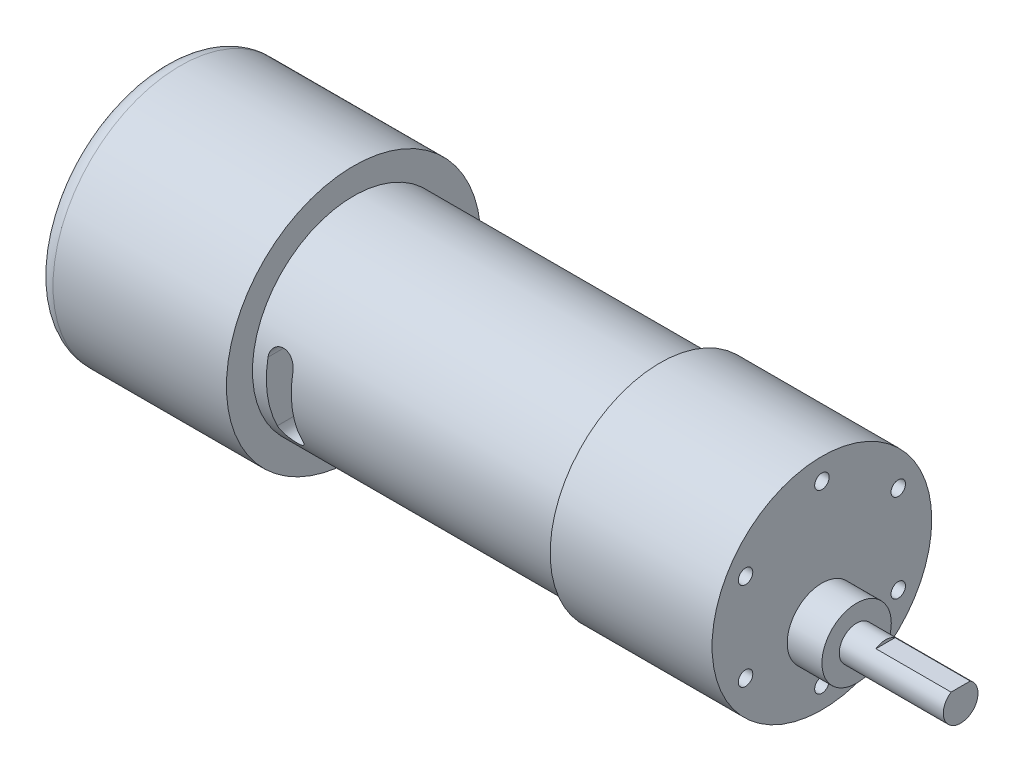
ISO-10303-21;
HEADER;
FILE_DESCRIPTION(('STEP AP214'),'2;1');
FILE_NAME('part.step','',(''),(''),'','','');
FILE_SCHEMA(('AUTOMOTIVE_DESIGN { 1 0 10303 214 1 1 1 1 }'));
ENDSEC;
DATA;
#1=APPLICATION_CONTEXT('core data for automotive mechanical design processes');
#2=APPLICATION_PROTOCOL_DEFINITION('international standard','automotive_design',2000,#1);
#3=PRODUCT_CONTEXT('',#1,'mechanical');
#4=PRODUCT('Part','Part','',(#3));
#5=PRODUCT_RELATED_PRODUCT_CATEGORY('part','',(#4));
#6=PRODUCT_DEFINITION_FORMATION('','',#4);
#7=PRODUCT_DEFINITION_CONTEXT('part definition',#1,'design');
#8=PRODUCT_DEFINITION('design','',#6,#7);
#9=PRODUCT_DEFINITION_SHAPE('','',#8);
#10=(LENGTH_UNIT() NAMED_UNIT(*) SI_UNIT(.MILLI.,.METRE.));
#11=(NAMED_UNIT(*) PLANE_ANGLE_UNIT() SI_UNIT($,.RADIAN.));
#12=(NAMED_UNIT(*) SI_UNIT($,.STERADIAN.) SOLID_ANGLE_UNIT());
#13=UNCERTAINTY_MEASURE_WITH_UNIT(LENGTH_MEASURE(1.E-05),#10,'distance_accuracy_value','');
#14=(GEOMETRIC_REPRESENTATION_CONTEXT(3) GLOBAL_UNCERTAINTY_ASSIGNED_CONTEXT((#13)) GLOBAL_UNIT_ASSIGNED_CONTEXT((#10,
#11,#12)) REPRESENTATION_CONTEXT('',''));
#15=CARTESIAN_POINT('',(0.,0.,0.));
#16=DIRECTION('',(0.,0.,1.));
#17=DIRECTION('',(1.,0.,0.));
#18=AXIS2_PLACEMENT_3D('',#15,#16,#17);
#19=CARTESIAN_POINT('',(86.,0.,0.));
#20=DIRECTION('',(-1.,0.,0.));
#21=DIRECTION('',(0.,0.,1.));
#22=AXIS2_PLACEMENT_3D('',#19,#20,#21);
#23=CYLINDRICAL_SURFACE('',#22,17.5);
#24=CARTESIAN_POINT('',(33.,0.,0.));
#25=DIRECTION('',(1.,0.,0.));
#26=DIRECTION('',(0.,0.,-1.));
#27=AXIS2_PLACEMENT_3D('',#24,#25,#26);
#28=CIRCLE('',#27,17.5);
#29=CARTESIAN_POINT('',(33.,0.,-17.5));
#30=VERTEX_POINT('',#29);
#31=EDGE_CURVE('E175',#30,#30,#28,.T.);
#32=ORIENTED_EDGE('',*,*,#31,.T.);
#33=EDGE_LOOP('',(#32));
#34=FACE_BOUND('',#33,.T.);
#35=CARTESIAN_POINT('',(86.,0.,0.));
#36=DIRECTION('',(1.,0.,0.));
#37=DIRECTION('',(0.,0.,-1.));
#38=AXIS2_PLACEMENT_3D('',#35,#36,#37);
#39=CIRCLE('',#38,17.5);
#40=CARTESIAN_POINT('',(86.,0.,-17.5));
#41=VERTEX_POINT('',#40);
#42=EDGE_CURVE('E178',#41,#41,#39,.T.);
#43=ORIENTED_EDGE('',*,*,#42,.F.);
#44=EDGE_LOOP('',(#43));
#45=FACE_BOUND('',#44,.T.);
#46=CARTESIAN_POINT('',(39.7178896678104,3.15679622133952,17.2129206591135));
#47=CARTESIAN_POINT('',(39.7178889870568,3.2188319337128,17.2015454589171));
#48=CARTESIAN_POINT('',(39.7152105834969,3.28077323972977,17.1898365886185));
#49=CARTESIAN_POINT('',(39.7045555370949,3.40407737245596,17.1658437611515));
#50=CARTESIAN_POINT('',(39.6965796425951,3.46544027963029,17.1535598854382));
#51=CARTESIAN_POINT('',(39.6648280700582,3.64788671336179,17.1160236901483));
#52=CARTESIAN_POINT('',(39.6332280630584,3.76755138666362,17.0900456804404));
#53=CARTESIAN_POINT('',(39.5501850541367,3.99951175653062,17.0372561486118));
#54=CARTESIAN_POINT('',(39.4987416841586,4.1118073163677,17.0104446110392));
#55=CARTESIAN_POINT('',(39.3774209978715,4.32608541214041,16.9572159845517));
#56=CARTESIAN_POINT('',(39.3075432453813,4.42806770397188,16.9307989049858));
#57=CARTESIAN_POINT('',(39.1506396914991,4.61948762741314,16.8795803174075));
#58=CARTESIAN_POINT('',(39.063507233333,4.70884099071964,16.8547902036319));
#59=CARTESIAN_POINT('',(38.8746199483859,4.8715475142951,16.80848587124));
#60=CARTESIAN_POINT('',(38.7728653466634,4.94490092078555,16.7869716022137));
#61=CARTESIAN_POINT('',(38.5598262167129,5.07178311380476,16.749069341878));
#62=CARTESIAN_POINT('',(38.4487936526176,5.12570426358736,16.7325810701007));
#63=CARTESIAN_POINT('',(38.2185511909904,5.21395430427986,16.7052935743593));
#64=CARTESIAN_POINT('',(38.0993441854243,5.24829008447956,16.6944923500397));
#65=CARTESIAN_POINT('',(37.8615841931476,5.2950326625184,16.6797244391255));
#66=CARTESIAN_POINT('',(37.7432187183825,5.30830940323488,16.675486800573));
#67=CARTESIAN_POINT('',(37.5058669470771,5.31519159362004,16.6732946859667));
#68=CARTESIAN_POINT('',(37.3868807520009,5.30880016355154,16.6753392132768));
#69=CARTESIAN_POINT('',(37.1548564071313,5.27701130558669,16.6854251113781));
#70=CARTESIAN_POINT('',(37.041743952718,5.25210264825717,16.6933122453274));
#71=CARTESIAN_POINT('',(36.8214046423497,5.18472299851316,16.7143615803207));
#72=CARTESIAN_POINT('',(36.7141781418517,5.14225094675143,16.7275240995514));
#73=CARTESIAN_POINT('',(36.5067682040922,5.04033545395822,16.7585167896321));
#74=CARTESIAN_POINT('',(36.4067193540537,4.98063967609071,16.776416006441));
#75=CARTESIAN_POINT('',(36.2179523673842,4.84635761637277,16.8156980119224));
#76=CARTESIAN_POINT('',(36.1292358997409,4.77176914532302,16.8370813126638));
#77=CARTESIAN_POINT('',(35.961797621524,4.60641630938719,16.8830854741623));
#78=CARTESIAN_POINT('',(35.8836315714927,4.51511595682235,16.9078028576336));
#79=CARTESIAN_POINT('',(35.7436016320416,4.32100744036646,16.9584476478304));
#80=CARTESIAN_POINT('',(35.6817461285302,4.2181933953729,16.9843756689615));
#81=CARTESIAN_POINT('',(35.5741877503541,4.00028158091751,17.0370393737844));
#82=CARTESIAN_POINT('',(35.5290714736973,3.88489421828459,17.0637740801111));
#83=CARTESIAN_POINT('',(35.4592408553248,3.64794158039796,17.115991645063));
#84=CARTESIAN_POINT('',(35.4344948188335,3.52638621625123,17.1414763902146));
#85=CARTESIAN_POINT('',(35.4156173361292,3.36261362217508,17.1739510435934));
#86=CARTESIAN_POINT('',(35.4120744885826,3.32153193499342,17.181943723364));
#87=CARTESIAN_POINT('',(35.4073528155727,3.23924707349994,17.1976458441353));
#88=CARTESIAN_POINT('',(35.4061702335244,3.19804419693458,17.2053557160186));
#89=CARTESIAN_POINT('',(35.4061679996393,3.15679622133952,17.2129206591135));
#90=B_SPLINE_CURVE_WITH_KNOTS('',3,(#46,#47,#48,#49,#50,#51,#52,#53,#54,#55,#56,#57,#58,#59,#60,
#61,#62,#63,#64,#65,#66,#67,#68,#69,#70,#71,#72,#73,#74,#75,#76,#77,#78,#79,#80,#81,#82,#83,#84,
#85,#86,#87,#88,#89),.UNSPECIFIED.,.F.,.F.,(4,2,2,2,2,2,2,2,2,2,2,2,2,2,2,2,2,2,2,2,2,4),(0.,
0.189088828804339,0.378150951932329,0.755602397707917,1.13306084481871,1.51052822388209,
1.89040608683015,2.27027810346941,2.64198192523403,3.01355491683926,3.36933644467415,
3.72506153235246,4.07171633698474,4.41839205337103,4.770429822236,5.1225193781742,
5.48898026647679,5.8556292013135,6.23412699013623,6.61203474175605,6.73799017160673,
6.86374497114983),.UNSPECIFIED.);
#91=CARTESIAN_POINT('',(39.7178896678104,3.15679622133952,17.2129206591135));
#92=VERTEX_POINT('',#91);
#93=CARTESIAN_POINT('',(35.4061679996393,3.15679622133952,17.2129206591135));
#94=VERTEX_POINT('',#93);
#95=EDGE_CURVE('E94',#92,#94,#90,.T.);
#96=ORIENTED_EDGE('',*,*,#95,.F.);
#97=CARTESIAN_POINT('',(39.7178896678104,0.,0.));
#98=DIRECTION('',(-1.,0.,0.));
#99=DIRECTION('',(0.,0.,1.));
#100=AXIS2_PLACEMENT_3D('',#97,#98,#99);
#101=CIRCLE('',#100,17.5);
#102=CARTESIAN_POINT('',(39.7178896678104,-7.93048806824317,15.5999153523169));
#103=VERTEX_POINT('',#102);
#104=EDGE_CURVE('E186',#103,#92,#101,.T.);
#105=ORIENTED_EDGE('',*,*,#104,.F.);
#106=CARTESIAN_POINT('',(35.4061679996393,-7.93048806824317,15.5999153523169));
#107=CARTESIAN_POINT('',(35.4061735444477,-7.99938232037778,15.5648948747989));
#108=CARTESIAN_POINT('',(35.4094713093709,-8.068000925465,15.5294332827809));
#109=CARTESIAN_POINT('',(35.4225264435981,-8.20427246709058,15.4578724833253));
#110=CARTESIAN_POINT('',(35.432282826045,-8.27192554954483,15.4217733741184));
#111=CARTESIAN_POINT('',(35.4710871277406,-8.47301709388899,15.3127779053144));
#112=CARTESIAN_POINT('',(35.509669575248,-8.60441051546948,15.2392737178706));
#113=CARTESIAN_POINT('',(35.6110899526343,-8.85798616100909,15.0932946255264));
#114=CARTESIAN_POINT('',(35.6739265635991,-8.98016888540381,15.02081966488));
#115=CARTESIAN_POINT('',(35.8229007531996,-9.21193225936976,14.8798066836795));
#116=CARTESIAN_POINT('',(35.9090142060153,-9.32152579063714,14.8112646754028));
#117=CARTESIAN_POINT('',(36.0858234094202,-9.50585692713411,14.6934826200426));
#118=CARTESIAN_POINT('',(36.1728617328191,-9.58331213237228,14.6429954832506));
#119=CARTESIAN_POINT('',(36.3609203770342,-9.72460705021011,14.5495422081406));
#120=CARTESIAN_POINT('',(36.4619245244072,-9.78846229833036,14.5065674983887));
#121=CARTESIAN_POINT('',(36.6601894291767,-9.89134719182712,14.4365697081855));
#122=CARTESIAN_POINT('',(36.7557590602458,-9.93265962568359,14.4081231443592));
#123=CARTESIAN_POINT('',(36.9539457592524,-10.0014663714341,14.3604468709907));
#124=CARTESIAN_POINT('',(37.0565589469861,-10.0289682230488,14.3412121326298));
#125=CARTESIAN_POINT('',(37.2666244632144,-10.0686981701018,14.3133478136086));
#126=CARTESIAN_POINT('',(37.37409623782,-10.0808579742602,14.3047656529543));
#127=CARTESIAN_POINT('',(37.5899443942622,-10.0888695238075,14.2991168221745));
#128=CARTESIAN_POINT('',(37.6983205711325,-10.0847248692424,14.3020476099747));
#129=CARTESIAN_POINT('',(37.9040832865734,-10.0613643569397,14.3184886078751));
#130=CARTESIAN_POINT('',(38.0016753298553,-10.043328384047,14.331170457069));
#131=CARTESIAN_POINT('',(38.1920339616606,-9.99458313005357,14.3652074008632));
#132=CARTESIAN_POINT('',(38.2847997584329,-9.9638717768785,14.3865639135221));
#133=CARTESIAN_POINT('',(38.4678062722001,-9.88944638875285,14.437831325882));
#134=CARTESIAN_POINT('',(38.5577253537853,-9.84519083848524,14.4680959600848));
#135=CARTESIAN_POINT('',(38.7288128462009,-9.74601608177857,14.5350868205442));
#136=CARTESIAN_POINT('',(38.8099776755571,-9.69109253647256,14.5718156753438));
#137=CARTESIAN_POINT('',(38.9740805703845,-9.5633401877464,14.6560294036775));
#138=CARTESIAN_POINT('',(39.0554848438245,-9.48906313046432,14.704301538807));
#139=CARTESIAN_POINT('',(39.204897009163,-9.33069896823637,14.8052995186692));
#140=CARTESIAN_POINT('',(39.2728946031731,-9.2466044006266,14.858028742893));
#141=CARTESIAN_POINT('',(39.4051595700716,-9.05575877110251,14.9752377634233));
#142=CARTESIAN_POINT('',(39.4669164085767,-8.94756758880887,15.0402112857936));
#143=CARTESIAN_POINT('',(39.5707664476586,-8.7229614309724,15.171581182718));
#144=CARTESIAN_POINT('',(39.612861169293,-8.60654709237375,15.2379774467933));
#145=CARTESIAN_POINT('',(39.6689017278972,-8.39693652069874,15.3542216204281));
#146=CARTESIAN_POINT('',(39.6871953818496,-8.30494355560849,15.4041837491066));
#147=CARTESIAN_POINT('',(39.7116785800142,-8.11896190354603,15.503021383263));
#148=CARTESIAN_POINT('',(39.7178851379133,-8.02497621030118,15.5518983202364));
#149=CARTESIAN_POINT('',(39.7178896678104,-7.93048806824317,15.5999153523169));
#150=B_SPLINE_CURVE_WITH_KNOTS('',3,(#106,#107,#108,#109,#110,#111,#112,#113,#114,#115,#116,
#117,#118,#119,#120,#121,#122,#123,#124,#125,#126,#127,#128,#129,#130,#131,#132,#133,#134,#135,
#136,#137,#138,#139,#140,#141,#142,#143,#144,#145,#146,#147,#148,#149),.UNSPECIFIED.,.F.,.F.,(4,
2,2,2,2,2,2,2,2,2,2,2,2,2,2,2,2,2,2,2,2,4),(0.,0.231694730392078,0.463354066697818,
0.927262208538877,1.39114512712908,1.85454907505342,2.23398793147364,2.61299099404385,
2.93542924055664,3.25769126390482,3.58138275256591,3.90500277373166,4.20381059607619,
4.50266728459747,4.81551799247659,5.12849620986241,5.48805318366857,5.84788527218816,
6.26768949551894,6.68746123749383,7.00559299187716,7.3232766223031),.UNSPECIFIED.);
#151=CARTESIAN_POINT('',(35.4061679996393,-7.93048806824317,15.5999153523169));
#152=VERTEX_POINT('',#151);
#153=EDGE_CURVE('E188',#152,#103,#150,.T.);
#154=ORIENTED_EDGE('',*,*,#153,.F.);
#155=CARTESIAN_POINT('',(35.4061679996393,0.,0.));
#156=DIRECTION('',(1.,0.,0.));
#157=DIRECTION('',(0.,0.,-1.));
#158=AXIS2_PLACEMENT_3D('',#155,#156,#157);
#159=CIRCLE('',#158,17.5);
#160=EDGE_CURVE('E196',#94,#152,#159,.T.);
#161=ORIENTED_EDGE('',*,*,#160,.F.);
#162=EDGE_LOOP('',(#96,#105,#154,#161));
#163=FACE_BOUND('',#162,.T.);
#164=ADVANCED_FACE('F34',(#34,#45,#163),#23,.T.);
#165=CARTESIAN_POINT('',(33.,0.,0.));
#166=DIRECTION('',(-1.,0.,0.));
#167=DIRECTION('',(0.,0.,1.));
#168=AXIS2_PLACEMENT_3D('',#165,#166,#167);
#169=CYLINDRICAL_SURFACE('',#168,22.);
#170=CARTESIAN_POINT('',(3.,0.,0.));
#171=DIRECTION('',(1.,0.,0.));
#172=DIRECTION('',(0.,0.,-1.));
#173=AXIS2_PLACEMENT_3D('',#170,#171,#172);
#174=CIRCLE('',#173,22.);
#175=CARTESIAN_POINT('',(3.,0.,-22.));
#176=VERTEX_POINT('',#175);
#177=EDGE_CURVE('E227',#176,#176,#174,.T.);
#178=ORIENTED_EDGE('',*,*,#177,.T.);
#179=EDGE_LOOP('',(#178));
#180=FACE_BOUND('',#179,.T.);
#181=CARTESIAN_POINT('',(33.,0.,0.));
#182=DIRECTION('',(1.,0.,0.));
#183=DIRECTION('',(0.,0.,-1.));
#184=AXIS2_PLACEMENT_3D('',#181,#182,#183);
#185=CIRCLE('',#184,22.);
#186=CARTESIAN_POINT('',(33.,0.,-22.));
#187=VERTEX_POINT('',#186);
#188=EDGE_CURVE('E181',#187,#187,#185,.T.);
#189=ORIENTED_EDGE('',*,*,#188,.F.);
#190=EDGE_LOOP('',(#189));
#191=FACE_BOUND('',#190,.T.);
#192=ADVANCED_FACE('F239',(#180,#191),#169,.T.);
#193=CARTESIAN_POINT('',(33.,0.,0.));
#194=DIRECTION('',(1.,0.,0.));
#195=DIRECTION('',(0.,0.,-1.));
#196=AXIS2_PLACEMENT_3D('',#193,#194,#195);
#197=PLANE('',#196);
#198=ORIENTED_EDGE('',*,*,#31,.F.);
#199=EDGE_LOOP('',(#198));
#200=FACE_BOUND('',#199,.T.);
#201=ORIENTED_EDGE('',*,*,#188,.T.);
#202=EDGE_LOOP('',(#201));
#203=FACE_BOUND('',#202,.T.);
#204=ADVANCED_FACE('F242',(#200,#203),#197,.T.);
#205=CARTESIAN_POINT('',(0.,0.,0.));
#206=DIRECTION('',(1.,0.,0.));
#207=DIRECTION('',(0.,0.,-1.));
#208=AXIS2_PLACEMENT_3D('',#205,#206,#207);
#209=PLANE('',#208);
#210=CARTESIAN_POINT('',(0.,0.,0.));
#211=DIRECTION('',(1.,0.,0.));
#212=DIRECTION('',(0.,0.,-1.));
#213=AXIS2_PLACEMENT_3D('',#210,#211,#212);
#214=CIRCLE('',#213,1.);
#215=CARTESIAN_POINT('',(0.,0.,-1.));
#216=VERTEX_POINT('',#215);
#217=EDGE_CURVE('E11',#216,#216,#214,.F.);
#218=ORIENTED_EDGE('',*,*,#217,.F.);
#219=EDGE_LOOP('',(#218));
#220=FACE_BOUND('',#219,.T.);
#221=CARTESIAN_POINT('',(0.,0.,0.));
#222=DIRECTION('',(1.,0.,0.));
#223=DIRECTION('',(0.,0.,-1.));
#224=AXIS2_PLACEMENT_3D('',#221,#222,#223);
#225=CIRCLE('',#224,19.);
#226=CARTESIAN_POINT('',(0.,0.,-19.));
#227=VERTEX_POINT('',#226);
#228=EDGE_CURVE('E42',#227,#227,#225,.F.);
#229=ORIENTED_EDGE('',*,*,#228,.T.);
#230=EDGE_LOOP('',(#229));
#231=FACE_BOUND('',#230,.T.);
#232=ADVANCED_FACE('F232',(#220,#231),#209,.F.);
#233=CARTESIAN_POINT('',(114.,0.,0.));
#234=DIRECTION('',(-1.,0.,0.));
#235=DIRECTION('',(0.,0.,1.));
#236=AXIS2_PLACEMENT_3D('',#233,#234,#235);
#237=CYLINDRICAL_SURFACE('',#236,19.);
#238=CARTESIAN_POINT('',(114.,0.,0.));
#239=DIRECTION('',(1.,0.,0.));
#240=DIRECTION('',(0.,0.,-1.));
#241=AXIS2_PLACEMENT_3D('',#238,#239,#240);
#242=CIRCLE('',#241,19.);
#243=CARTESIAN_POINT('',(114.,0.,-19.));
#244=VERTEX_POINT('',#243);
#245=EDGE_CURVE('E172',#244,#244,#242,.T.);
#246=ORIENTED_EDGE('',*,*,#245,.F.);
#247=EDGE_LOOP('',(#246));
#248=FACE_BOUND('',#247,.T.);
#249=CARTESIAN_POINT('',(86.,0.,0.));
#250=DIRECTION('',(1.,0.,0.));
#251=DIRECTION('',(0.,0.,-1.));
#252=AXIS2_PLACEMENT_3D('',#249,#250,#251);
#253=CIRCLE('',#252,19.);
#254=CARTESIAN_POINT('',(86.,0.,-19.));
#255=VERTEX_POINT('',#254);
#256=EDGE_CURVE('E171',#255,#255,#253,.T.);
#257=ORIENTED_EDGE('',*,*,#256,.T.);
#258=EDGE_LOOP('',(#257));
#259=FACE_BOUND('',#258,.T.);
#260=ADVANCED_FACE('F250',(#248,#259),#237,.T.);
#261=CARTESIAN_POINT('',(114.,0.,0.));
#262=DIRECTION('',(1.,0.,0.));
#263=DIRECTION('',(0.,0.,-1.));
#264=AXIS2_PLACEMENT_3D('',#261,#262,#263);
#265=PLANE('',#264);
#266=CARTESIAN_POINT('',(114.,-6.,0.));
#267=DIRECTION('',(1.,0.,0.));
#268=DIRECTION('',(0.,0.,-1.));
#269=AXIS2_PLACEMENT_3D('',#266,#267,#268);
#270=CIRCLE('',#269,6.);
#271=CARTESIAN_POINT('',(114.,-6.,-6.));
#272=VERTEX_POINT('',#271);
#273=EDGE_CURVE('E107',#272,#272,#270,.T.);
#274=ORIENTED_EDGE('',*,*,#273,.F.);
#275=EDGE_LOOP('',(#274));
#276=FACE_BOUND('',#275,.T.);
#277=CARTESIAN_POINT('',(114.,7.62499999999943,13.2068874077124));
#278=DIRECTION('',(1.,0.,0.));
#279=DIRECTION('',(0.,0.,-1.));
#280=AXIS2_PLACEMENT_3D('',#277,#278,#279);
#281=CIRCLE('',#280,1.25000000000066);
#282=CARTESIAN_POINT('',(114.,7.62499999999943,11.9568874077117));
#283=VERTEX_POINT('',#282);
#284=EDGE_CURVE('E114',#283,#283,#281,.T.);
#285=ORIENTED_EDGE('',*,*,#284,.F.);
#286=EDGE_LOOP('',(#285));
#287=FACE_BOUND('',#286,.T.);
#288=CARTESIAN_POINT('',(114.,-7.62500000000057,13.2068874077117));
#289=DIRECTION('',(1.,0.,0.));
#290=DIRECTION('',(0.,0.,-1.));
#291=AXIS2_PLACEMENT_3D('',#288,#289,#290);
#292=CIRCLE('',#291,1.25000000000124);
#293=CARTESIAN_POINT('',(114.,-7.62500000000057,11.9568874077105));
#294=VERTEX_POINT('',#293);
#295=EDGE_CURVE('E120',#294,#294,#292,.T.);
#296=ORIENTED_EDGE('',*,*,#295,.F.);
#297=EDGE_LOOP('',(#296));
#298=FACE_BOUND('',#297,.T.);
#299=CARTESIAN_POINT('',(114.,-15.25,-1.29655803370358E-12));
#300=DIRECTION('',(1.,0.,0.));
#301=DIRECTION('',(0.,0.,-1.));
#302=AXIS2_PLACEMENT_3D('',#299,#300,#301);
#303=CIRCLE('',#302,1.25000000000134);
#304=CARTESIAN_POINT('',(114.,-15.25,-1.25000000000264));
#305=VERTEX_POINT('',#304);
#306=EDGE_CURVE('E126',#305,#305,#303,.T.);
#307=ORIENTED_EDGE('',*,*,#306,.F.);
#308=EDGE_LOOP('',(#307));
#309=FACE_BOUND('',#308,.T.);
#310=CARTESIAN_POINT('',(114.,-7.62499999999944,-13.2068874077137));
#311=DIRECTION('',(1.,0.,0.));
#312=DIRECTION('',(0.,0.,-1.));
#313=AXIS2_PLACEMENT_3D('',#310,#311,#312);
#314=CIRCLE('',#313,1.25000000000084);
#315=CARTESIAN_POINT('',(114.,-7.62499999999944,-14.4568874077145));
#316=VERTEX_POINT('',#315);
#317=EDGE_CURVE('E132',#316,#316,#314,.T.);
#318=ORIENTED_EDGE('',*,*,#317,.F.);
#319=EDGE_LOOP('',(#318));
#320=FACE_BOUND('',#319,.T.);
#321=CARTESIAN_POINT('',(114.,7.62500000000056,-13.206887407713));
#322=DIRECTION('',(1.,0.,0.));
#323=DIRECTION('',(0.,0.,-1.));
#324=AXIS2_PLACEMENT_3D('',#321,#322,#323);
#325=CIRCLE('',#324,1.25000000000018);
#326=CARTESIAN_POINT('',(114.,7.62500000000056,-14.4568874077132));
#327=VERTEX_POINT('',#326);
#328=EDGE_CURVE('E138',#327,#327,#325,.T.);
#329=ORIENTED_EDGE('',*,*,#328,.F.);
#330=EDGE_LOOP('',(#329));
#331=FACE_BOUND('',#330,.T.);
#332=CARTESIAN_POINT('',(114.,15.25,0.));
#333=DIRECTION('',(1.,0.,0.));
#334=DIRECTION('',(0.,0.,-1.));
#335=AXIS2_PLACEMENT_3D('',#332,#333,#334);
#336=CIRCLE('',#335,1.25);
#337=CARTESIAN_POINT('',(114.,15.25,-1.25));
#338=VERTEX_POINT('',#337);
#339=EDGE_CURVE('E144',#338,#338,#336,.T.);
#340=ORIENTED_EDGE('',*,*,#339,.F.);
#341=EDGE_LOOP('',(#340));
#342=FACE_BOUND('',#341,.T.);
#343=ORIENTED_EDGE('',*,*,#245,.T.);
#344=EDGE_LOOP('',(#343));
#345=FACE_BOUND('',#344,.T.);
#346=ADVANCED_FACE('F219',(#276,#287,#298,#309,#320,#331,#342,#345),#265,.T.);
#347=CARTESIAN_POINT('',(86.,0.,0.));
#348=DIRECTION('',(1.,0.,0.));
#349=DIRECTION('',(0.,0.,-1.));
#350=AXIS2_PLACEMENT_3D('',#347,#348,#349);
#351=PLANE('',#350);
#352=ORIENTED_EDGE('',*,*,#42,.T.);
#353=EDGE_LOOP('',(#352));
#354=FACE_BOUND('',#353,.T.);
#355=ORIENTED_EDGE('',*,*,#256,.F.);
#356=EDGE_LOOP('',(#355));
#357=FACE_BOUND('',#356,.T.);
#358=ADVANCED_FACE('F217',(#354,#357),#351,.F.);
#359=CARTESIAN_POINT('',(37.5620288337249,3.15679622133952,22.));
#360=DIRECTION('',(0.,0.,-1.));
#361=DIRECTION('',(-1.,0.,0.));
#362=AXIS2_PLACEMENT_3D('',#359,#360,#361);
#363=CYLINDRICAL_SURFACE('',#362,2.15586083408553);
#364=ORIENTED_EDGE('',*,*,#95,.T.);
#365=DIRECTION('',(0.,0.,-1.));
#366=VECTOR('',#365,1.);
#367=CARTESIAN_POINT('',(35.4061679996393,3.15679622133952,22.));
#368=LINE('',#367,#366);
#369=CARTESIAN_POINT('',(35.4061679996393,3.15679622133952,0.));
#370=VERTEX_POINT('',#369);
#371=EDGE_CURVE('E169',#94,#370,#368,.T.);
#372=ORIENTED_EDGE('',*,*,#371,.T.);
#373=CARTESIAN_POINT('',(37.5620288337249,3.15679622133952,0.));
#374=DIRECTION('',(0.,0.,1.));
#375=DIRECTION('',(1.,0.,0.));
#376=AXIS2_PLACEMENT_3D('',#373,#374,#375);
#377=CIRCLE('',#376,2.15586083408553);
#378=CARTESIAN_POINT('',(39.7178896678104,3.15679622133952,0.));
#379=VERTEX_POINT('',#378);
#380=EDGE_CURVE('E150',#379,#370,#377,.T.);
#381=ORIENTED_EDGE('',*,*,#380,.F.);
#382=DIRECTION('',(0.,0.,-1.));
#383=VECTOR('',#382,1.);
#384=CARTESIAN_POINT('',(39.7178896678104,3.15679622133952,22.));
#385=LINE('',#384,#383);
#386=EDGE_CURVE('E164',#92,#379,#385,.T.);
#387=ORIENTED_EDGE('',*,*,#386,.F.);
#388=EDGE_LOOP('',(#364,#372,#381,#387));
#389=FACE_BOUND('',#388,.T.);
#390=ADVANCED_FACE('F212',(#389),#363,.F.);
#391=CARTESIAN_POINT('',(35.4061679996393,3.15679622133952,22.));
#392=DIRECTION('',(1.,0.,0.));
#393=DIRECTION('',(0.,0.,-1.));
#394=AXIS2_PLACEMENT_3D('',#391,#392,#393);
#395=PLANE('',#394);
#396=ORIENTED_EDGE('',*,*,#160,.T.);
#397=DIRECTION('',(0.,0.,-1.));
#398=VECTOR('',#397,1.);
#399=CARTESIAN_POINT('',(35.4061679996393,-7.93048806824317,22.));
#400=LINE('',#399,#398);
#401=CARTESIAN_POINT('',(35.4061679996393,-7.93048806824317,0.));
#402=VERTEX_POINT('',#401);
#403=EDGE_CURVE('E167',#152,#402,#400,.T.);
#404=ORIENTED_EDGE('',*,*,#403,.T.);
#405=DIRECTION('',(0.,-1.,0.));
#406=VECTOR('',#405,1.);
#407=CARTESIAN_POINT('',(35.4061679996393,3.15679622133952,0.));
#408=LINE('',#407,#406);
#409=EDGE_CURVE('E155',#370,#402,#408,.T.);
#410=ORIENTED_EDGE('',*,*,#409,.F.);
#411=ORIENTED_EDGE('',*,*,#371,.F.);
#412=EDGE_LOOP('',(#396,#404,#410,#411));
#413=FACE_BOUND('',#412,.T.);
#414=ADVANCED_FACE('F207',(#413),#395,.T.);
#415=CARTESIAN_POINT('',(37.5620288337249,-7.93048806824317,22.));
#416=DIRECTION('',(0.,0.,-1.));
#417=DIRECTION('',(-1.,0.,0.));
#418=AXIS2_PLACEMENT_3D('',#415,#416,#417);
#419=CYLINDRICAL_SURFACE('',#418,2.15586083408553);
#420=ORIENTED_EDGE('',*,*,#153,.T.);
#421=DIRECTION('',(0.,0.,-1.));
#422=VECTOR('',#421,1.);
#423=CARTESIAN_POINT('',(39.7178896678104,-7.93048806824317,22.));
#424=LINE('',#423,#422);
#425=CARTESIAN_POINT('',(39.7178896678104,-7.93048806824317,0.));
#426=VERTEX_POINT('',#425);
#427=EDGE_CURVE('E57',#103,#426,#424,.T.);
#428=ORIENTED_EDGE('',*,*,#427,.T.);
#429=CARTESIAN_POINT('',(37.5620288337249,-7.93048806824317,0.));
#430=DIRECTION('',(0.,0.,1.));
#431=DIRECTION('',(1.,0.,0.));
#432=AXIS2_PLACEMENT_3D('',#429,#430,#431);
#433=CIRCLE('',#432,2.15586083408553);
#434=EDGE_CURVE('E158',#402,#426,#433,.T.);
#435=ORIENTED_EDGE('',*,*,#434,.F.);
#436=ORIENTED_EDGE('',*,*,#403,.F.);
#437=EDGE_LOOP('',(#420,#428,#435,#436));
#438=FACE_BOUND('',#437,.T.);
#439=ADVANCED_FACE('F201',(#438),#419,.F.);
#440=CARTESIAN_POINT('',(39.7178896678104,3.15679622133952,22.));
#441=DIRECTION('',(-1.,0.,0.));
#442=DIRECTION('',(0.,0.,1.));
#443=AXIS2_PLACEMENT_3D('',#440,#441,#442);
#444=PLANE('',#443);
#445=ORIENTED_EDGE('',*,*,#104,.T.);
#446=ORIENTED_EDGE('',*,*,#386,.T.);
#447=DIRECTION('',(0.,1.,0.));
#448=VECTOR('',#447,1.);
#449=CARTESIAN_POINT('',(39.7178896678104,3.15679622133952,0.));
#450=LINE('',#449,#448);
#451=EDGE_CURVE('E161',#426,#379,#450,.T.);
#452=ORIENTED_EDGE('',*,*,#451,.F.);
#453=ORIENTED_EDGE('',*,*,#427,.F.);
#454=EDGE_LOOP('',(#445,#446,#452,#453));
#455=FACE_BOUND('',#454,.T.);
#456=ADVANCED_FACE('F206',(#455),#444,.T.);
#457=CARTESIAN_POINT('',(37.5620288337249,3.15679622133952,0.));
#458=DIRECTION('',(0.,0.,1.));
#459=DIRECTION('',(1.,0.,0.));
#460=AXIS2_PLACEMENT_3D('',#457,#458,#459);
#461=PLANE('',#460);
#462=ORIENTED_EDGE('',*,*,#380,.T.);
#463=ORIENTED_EDGE('',*,*,#409,.T.);
#464=ORIENTED_EDGE('',*,*,#434,.T.);
#465=ORIENTED_EDGE('',*,*,#451,.T.);
#466=EDGE_LOOP('',(#462,#463,#464,#465));
#467=FACE_BOUND('',#466,.T.);
#468=ADVANCED_FACE('F272',(#467),#461,.T.);
#469=CARTESIAN_POINT('',(110.5,15.25,0.));
#470=DIRECTION('',(1.,0.,0.));
#471=DIRECTION('',(0.,0.,-1.));
#472=AXIS2_PLACEMENT_3D('',#469,#470,#471);
#473=CYLINDRICAL_SURFACE('',#472,1.25);
#474=CARTESIAN_POINT('',(110.5,15.25,0.));
#475=DIRECTION('',(1.,0.,0.));
#476=DIRECTION('',(0.,0.,-1.));
#477=AXIS2_PLACEMENT_3D('',#474,#475,#476);
#478=CIRCLE('',#477,1.25);
#479=CARTESIAN_POINT('',(110.5,15.25,-1.25));
#480=VERTEX_POINT('',#479);
#481=EDGE_CURVE('E147',#480,#480,#478,.T.);
#482=ORIENTED_EDGE('',*,*,#481,.F.);
#483=EDGE_LOOP('',(#482));
#484=FACE_BOUND('',#483,.T.);
#485=ORIENTED_EDGE('',*,*,#339,.T.);
#486=EDGE_LOOP('',(#485));
#487=FACE_BOUND('',#486,.T.);
#488=ADVANCED_FACE('F277',(#484,#487),#473,.F.);
#489=CARTESIAN_POINT('',(110.5,15.25,0.));
#490=DIRECTION('',(1.,0.,0.));
#491=DIRECTION('',(0.,0.,-1.));
#492=AXIS2_PLACEMENT_3D('',#489,#490,#491);
#493=PLANE('',#492);
#494=ORIENTED_EDGE('',*,*,#481,.T.);
#495=EDGE_LOOP('',(#494));
#496=FACE_BOUND('',#495,.T.);
#497=ADVANCED_FACE('F281',(#496),#493,.T.);
#498=CARTESIAN_POINT('',(110.5,7.62500000000056,-13.206887407713));
#499=DIRECTION('',(1.,0.,0.));
#500=DIRECTION('',(0.,0.,-1.));
#501=AXIS2_PLACEMENT_3D('',#498,#499,#500);
#502=CYLINDRICAL_SURFACE('',#501,1.25000000000018);
#503=CARTESIAN_POINT('',(110.5,7.62500000000056,-13.206887407713));
#504=DIRECTION('',(1.,0.,0.));
#505=DIRECTION('',(0.,0.,-1.));
#506=AXIS2_PLACEMENT_3D('',#503,#504,#505);
#507=CIRCLE('',#506,1.25000000000018);
#508=CARTESIAN_POINT('',(110.5,7.62500000000056,-14.4568874077132));
#509=VERTEX_POINT('',#508);
#510=EDGE_CURVE('E141',#509,#509,#507,.T.);
#511=ORIENTED_EDGE('',*,*,#510,.F.);
#512=EDGE_LOOP('',(#511));
#513=FACE_BOUND('',#512,.T.);
#514=ORIENTED_EDGE('',*,*,#328,.T.);
#515=EDGE_LOOP('',(#514));
#516=FACE_BOUND('',#515,.T.);
#517=ADVANCED_FACE('F287',(#513,#516),#502,.F.);
#518=CARTESIAN_POINT('',(110.5,7.62500000000056,-13.206887407713));
#519=DIRECTION('',(1.,0.,0.));
#520=DIRECTION('',(0.,0.,-1.));
#521=AXIS2_PLACEMENT_3D('',#518,#519,#520);
#522=PLANE('',#521);
#523=ORIENTED_EDGE('',*,*,#510,.T.);
#524=EDGE_LOOP('',(#523));
#525=FACE_BOUND('',#524,.T.);
#526=ADVANCED_FACE('F291',(#525),#522,.T.);
#527=CARTESIAN_POINT('',(110.5,-7.62499999999944,-13.2068874077137));
#528=DIRECTION('',(1.,0.,0.));
#529=DIRECTION('',(0.,0.,-1.));
#530=AXIS2_PLACEMENT_3D('',#527,#528,#529);
#531=CYLINDRICAL_SURFACE('',#530,1.25000000000084);
#532=CARTESIAN_POINT('',(110.5,-7.62499999999944,-13.2068874077137));
#533=DIRECTION('',(1.,0.,0.));
#534=DIRECTION('',(0.,0.,-1.));
#535=AXIS2_PLACEMENT_3D('',#532,#533,#534);
#536=CIRCLE('',#535,1.25000000000084);
#537=CARTESIAN_POINT('',(110.5,-7.62499999999944,-14.4568874077145));
#538=VERTEX_POINT('',#537);
#539=EDGE_CURVE('E135',#538,#538,#536,.T.);
#540=ORIENTED_EDGE('',*,*,#539,.F.);
#541=EDGE_LOOP('',(#540));
#542=FACE_BOUND('',#541,.T.);
#543=ORIENTED_EDGE('',*,*,#317,.T.);
#544=EDGE_LOOP('',(#543));
#545=FACE_BOUND('',#544,.T.);
#546=ADVANCED_FACE('F295',(#542,#545),#531,.F.);
#547=CARTESIAN_POINT('',(110.5,-7.62499999999944,-13.2068874077137));
#548=DIRECTION('',(1.,0.,0.));
#549=DIRECTION('',(0.,0.,-1.));
#550=AXIS2_PLACEMENT_3D('',#547,#548,#549);
#551=PLANE('',#550);
#552=ORIENTED_EDGE('',*,*,#539,.T.);
#553=EDGE_LOOP('',(#552));
#554=FACE_BOUND('',#553,.T.);
#555=ADVANCED_FACE('F299',(#554),#551,.T.);
#556=CARTESIAN_POINT('',(110.5,-15.25,-1.29655803370358E-12));
#557=DIRECTION('',(1.,0.,0.));
#558=DIRECTION('',(0.,0.,-1.));
#559=AXIS2_PLACEMENT_3D('',#556,#557,#558);
#560=CYLINDRICAL_SURFACE('',#559,1.25000000000134);
#561=CARTESIAN_POINT('',(110.5,-15.25,-1.29655803370358E-12));
#562=DIRECTION('',(1.,0.,0.));
#563=DIRECTION('',(0.,0.,-1.));
#564=AXIS2_PLACEMENT_3D('',#561,#562,#563);
#565=CIRCLE('',#564,1.25000000000134);
#566=CARTESIAN_POINT('',(110.5,-15.25,-1.25000000000264));
#567=VERTEX_POINT('',#566);
#568=EDGE_CURVE('E129',#567,#567,#565,.T.);
#569=ORIENTED_EDGE('',*,*,#568,.F.);
#570=EDGE_LOOP('',(#569));
#571=FACE_BOUND('',#570,.T.);
#572=ORIENTED_EDGE('',*,*,#306,.T.);
#573=EDGE_LOOP('',(#572));
#574=FACE_BOUND('',#573,.T.);
#575=ADVANCED_FACE('F303',(#571,#574),#560,.F.);
#576=CARTESIAN_POINT('',(110.5,-15.25,-1.29655803370358E-12));
#577=DIRECTION('',(1.,0.,0.));
#578=DIRECTION('',(0.,0.,-1.));
#579=AXIS2_PLACEMENT_3D('',#576,#577,#578);
#580=PLANE('',#579);
#581=ORIENTED_EDGE('',*,*,#568,.T.);
#582=EDGE_LOOP('',(#581));
#583=FACE_BOUND('',#582,.T.);
#584=ADVANCED_FACE('F307',(#583),#580,.T.);
#585=CARTESIAN_POINT('',(110.5,-7.62500000000057,13.2068874077117));
#586=DIRECTION('',(1.,0.,0.));
#587=DIRECTION('',(0.,0.,-1.));
#588=AXIS2_PLACEMENT_3D('',#585,#586,#587);
#589=CYLINDRICAL_SURFACE('',#588,1.25000000000124);
#590=CARTESIAN_POINT('',(110.5,-7.62500000000057,13.2068874077117));
#591=DIRECTION('',(1.,0.,0.));
#592=DIRECTION('',(0.,0.,-1.));
#593=AXIS2_PLACEMENT_3D('',#590,#591,#592);
#594=CIRCLE('',#593,1.25000000000124);
#595=CARTESIAN_POINT('',(110.5,-7.62500000000057,11.9568874077105));
#596=VERTEX_POINT('',#595);
#597=EDGE_CURVE('E123',#596,#596,#594,.T.);
#598=ORIENTED_EDGE('',*,*,#597,.F.);
#599=EDGE_LOOP('',(#598));
#600=FACE_BOUND('',#599,.T.);
#601=ORIENTED_EDGE('',*,*,#295,.T.);
#602=EDGE_LOOP('',(#601));
#603=FACE_BOUND('',#602,.T.);
#604=ADVANCED_FACE('F311',(#600,#603),#589,.F.);
#605=CARTESIAN_POINT('',(110.5,-7.62500000000057,13.2068874077117));
#606=DIRECTION('',(1.,0.,0.));
#607=DIRECTION('',(0.,0.,-1.));
#608=AXIS2_PLACEMENT_3D('',#605,#606,#607);
#609=PLANE('',#608);
#610=ORIENTED_EDGE('',*,*,#597,.T.);
#611=EDGE_LOOP('',(#610));
#612=FACE_BOUND('',#611,.T.);
#613=ADVANCED_FACE('F315',(#612),#609,.T.);
#614=CARTESIAN_POINT('',(110.5,7.62499999999943,13.2068874077124));
#615=DIRECTION('',(1.,0.,0.));
#616=DIRECTION('',(0.,0.,-1.));
#617=AXIS2_PLACEMENT_3D('',#614,#615,#616);
#618=CYLINDRICAL_SURFACE('',#617,1.25000000000066);
#619=CARTESIAN_POINT('',(110.5,7.62499999999943,13.2068874077124));
#620=DIRECTION('',(1.,0.,0.));
#621=DIRECTION('',(0.,0.,-1.));
#622=AXIS2_PLACEMENT_3D('',#619,#620,#621);
#623=CIRCLE('',#622,1.25000000000066);
#624=CARTESIAN_POINT('',(110.5,7.62499999999943,11.9568874077117));
#625=VERTEX_POINT('',#624);
#626=EDGE_CURVE('E117',#625,#625,#623,.T.);
#627=ORIENTED_EDGE('',*,*,#626,.F.);
#628=EDGE_LOOP('',(#627));
#629=FACE_BOUND('',#628,.T.);
#630=ORIENTED_EDGE('',*,*,#284,.T.);
#631=EDGE_LOOP('',(#630));
#632=FACE_BOUND('',#631,.T.);
#633=ADVANCED_FACE('F319',(#629,#632),#618,.F.);
#634=CARTESIAN_POINT('',(110.5,7.62499999999943,13.2068874077124));
#635=DIRECTION('',(1.,0.,0.));
#636=DIRECTION('',(0.,0.,-1.));
#637=AXIS2_PLACEMENT_3D('',#634,#635,#636);
#638=PLANE('',#637);
#639=ORIENTED_EDGE('',*,*,#626,.T.);
#640=EDGE_LOOP('',(#639));
#641=FACE_BOUND('',#640,.T.);
#642=ADVANCED_FACE('F323',(#641),#638,.T.);
#643=CARTESIAN_POINT('',(120.,-6.,0.));
#644=DIRECTION('',(-1.,0.,0.));
#645=DIRECTION('',(0.,0.,1.));
#646=AXIS2_PLACEMENT_3D('',#643,#644,#645);
#647=CYLINDRICAL_SURFACE('',#646,6.);
#648=CARTESIAN_POINT('',(120.,-6.,0.));
#649=DIRECTION('',(1.,0.,0.));
#650=DIRECTION('',(0.,0.,-1.));
#651=AXIS2_PLACEMENT_3D('',#648,#649,#650);
#652=CIRCLE('',#651,6.);
#653=CARTESIAN_POINT('',(120.,-6.,-6.));
#654=VERTEX_POINT('',#653);
#655=EDGE_CURVE('E111',#654,#654,#652,.T.);
#656=ORIENTED_EDGE('',*,*,#655,.F.);
#657=EDGE_LOOP('',(#656));
#658=FACE_BOUND('',#657,.T.);
#659=ORIENTED_EDGE('',*,*,#273,.T.);
#660=EDGE_LOOP('',(#659));
#661=FACE_BOUND('',#660,.T.);
#662=ADVANCED_FACE('F327',(#658,#661),#647,.T.);
#663=CARTESIAN_POINT('',(120.,-6.,0.));
#664=DIRECTION('',(1.,0.,0.));
#665=DIRECTION('',(0.,0.,-1.));
#666=AXIS2_PLACEMENT_3D('',#663,#664,#665);
#667=PLANE('',#666);
#668=CARTESIAN_POINT('',(120.,-6.,0.));
#669=DIRECTION('',(1.,0.,0.));
#670=DIRECTION('',(0.,0.,-1.));
#671=AXIS2_PLACEMENT_3D('',#668,#669,#670);
#672=CIRCLE('',#671,3.);
#673=CARTESIAN_POINT('',(120.,-6.,-3.));
#674=VERTEX_POINT('',#673);
#675=EDGE_CURVE('E104',#674,#674,#672,.F.);
#676=ORIENTED_EDGE('',*,*,#675,.T.);
#677=EDGE_LOOP('',(#676));
#678=FACE_BOUND('',#677,.T.);
#679=ORIENTED_EDGE('',*,*,#655,.T.);
#680=EDGE_LOOP('',(#679));
#681=FACE_BOUND('',#680,.T.);
#682=ADVANCED_FACE('F331',(#678,#681),#667,.T.);
#683=CARTESIAN_POINT('',(138.,-6.,0.));
#684=DIRECTION('',(-1.,0.,0.));
#685=DIRECTION('',(0.,0.,1.));
#686=AXIS2_PLACEMENT_3D('',#683,#684,#685);
#687=CYLINDRICAL_SURFACE('',#686,3.);
#688=CARTESIAN_POINT('',(138.,-6.,0.));
#689=DIRECTION('',(1.,0.,0.));
#690=DIRECTION('',(0.,0.,-1.));
#691=AXIS2_PLACEMENT_3D('',#688,#689,#690);
#692=CIRCLE('',#691,3.);
#693=CARTESIAN_POINT('',(138.,-3.5,1.6583123951777));
#694=VERTEX_POINT('',#693);
#695=CARTESIAN_POINT('',(138.,-3.5,-1.6583123951777));
#696=VERTEX_POINT('',#695);
#697=EDGE_CURVE('E100',#694,#696,#692,.T.);
#698=ORIENTED_EDGE('',*,*,#697,.F.);
#699=DIRECTION('',(-1.,0.,0.));
#700=VECTOR('',#699,1.);
#701=CARTESIAN_POINT('',(138.,-3.5,1.6583123951777));
#702=LINE('',#701,#700);
#703=CARTESIAN_POINT('',(125.,-3.5,1.6583123951777));
#704=VERTEX_POINT('',#703);
#705=EDGE_CURVE('E49',#694,#704,#702,.T.);
#706=ORIENTED_EDGE('',*,*,#705,.T.);
#707=CARTESIAN_POINT('',(125.,-6.,0.));
#708=DIRECTION('',(1.,0.,0.));
#709=DIRECTION('',(0.,0.,-1.));
#710=AXIS2_PLACEMENT_3D('',#707,#708,#709);
#711=CIRCLE('',#710,3.);
#712=CARTESIAN_POINT('',(125.,-3.5,-1.6583123951777));
#713=VERTEX_POINT('',#712);
#714=EDGE_CURVE('E93',#713,#704,#711,.T.);
#715=ORIENTED_EDGE('',*,*,#714,.F.);
#716=DIRECTION('',(-1.,0.,0.));
#717=VECTOR('',#716,1.);
#718=CARTESIAN_POINT('',(138.,-3.5,-1.6583123951777));
#719=LINE('',#718,#717);
#720=EDGE_CURVE('E88',#713,#696,#719,.F.);
#721=ORIENTED_EDGE('',*,*,#720,.T.);
#722=EDGE_LOOP('',(#698,#706,#715,#721));
#723=FACE_BOUND('',#722,.T.);
#724=ORIENTED_EDGE('',*,*,#675,.F.);
#725=EDGE_LOOP('',(#724));
#726=FACE_BOUND('',#725,.T.);
#727=ADVANCED_FACE('F98',(#723,#726),#687,.T.);
#728=CARTESIAN_POINT('',(138.,-6.,0.));
#729=DIRECTION('',(1.,0.,0.));
#730=DIRECTION('',(0.,0.,-1.));
#731=AXIS2_PLACEMENT_3D('',#728,#729,#730);
#732=PLANE('',#731);
#733=DIRECTION('',(0.,0.,-1.));
#734=VECTOR('',#733,1.);
#735=CARTESIAN_POINT('',(138.,-3.5,0.));
#736=LINE('',#735,#734);
#737=EDGE_CURVE('E85',#694,#696,#736,.T.);
#738=ORIENTED_EDGE('',*,*,#737,.F.);
#739=ORIENTED_EDGE('',*,*,#697,.T.);
#740=EDGE_LOOP('',(#738,#739));
#741=FACE_BOUND('',#740,.T.);
#742=ADVANCED_FACE('F103',(#741),#732,.T.);
#743=CARTESIAN_POINT('',(125.,0.,0.));
#744=DIRECTION('',(1.,0.,0.));
#745=DIRECTION('',(0.,0.,-1.));
#746=AXIS2_PLACEMENT_3D('',#743,#744,#745);
#747=PLANE('',#746);
#748=ORIENTED_EDGE('',*,*,#714,.T.);
#749=DIRECTION('',(0.,0.,-1.));
#750=VECTOR('',#749,1.);
#751=CARTESIAN_POINT('',(125.,-3.5,2.17841584869424));
#752=LINE('',#751,#750);
#753=EDGE_CURVE('E101',#704,#713,#752,.T.);
#754=ORIENTED_EDGE('',*,*,#753,.T.);
#755=EDGE_LOOP('',(#748,#754));
#756=FACE_BOUND('',#755,.T.);
#757=ADVANCED_FACE('F340',(#756),#747,.T.);
#758=CARTESIAN_POINT('',(125.,-3.5,-1.6583123951777));
#759=DIRECTION('',(0.,-1.,0.));
#760=DIRECTION('',(0.,0.,-1.));
#761=AXIS2_PLACEMENT_3D('',#758,#759,#760);
#762=PLANE('',#761);
#763=ORIENTED_EDGE('',*,*,#737,.T.);
#764=ORIENTED_EDGE('',*,*,#720,.F.);
#765=ORIENTED_EDGE('',*,*,#753,.F.);
#766=ORIENTED_EDGE('',*,*,#705,.F.);
#767=EDGE_LOOP('',(#763,#764,#765,#766));
#768=FACE_BOUND('',#767,.T.);
#769=ADVANCED_FACE('F87',(#768),#762,.F.);
#770=CARTESIAN_POINT('',(3.,0.,0.));
#771=DIRECTION('',(1.,0.,0.));
#772=DIRECTION('',(0.,0.,-1.));
#773=AXIS2_PLACEMENT_3D('',#770,#771,#772);
#774=TOROIDAL_SURFACE('',#773,19.,3.);
#775=ORIENTED_EDGE('',*,*,#228,.F.);
#776=EDGE_LOOP('',(#775));
#777=FACE_BOUND('',#776,.T.);
#778=ORIENTED_EDGE('',*,*,#177,.F.);
#779=EDGE_LOOP('',(#778));
#780=FACE_BOUND('',#779,.T.);
#781=ADVANCED_FACE('F36',(#777,#780),#774,.T.);
#782=CARTESIAN_POINT('',(-5.,0.,0.));
#783=DIRECTION('',(1.,0.,0.));
#784=DIRECTION('',(0.,0.,-1.));
#785=AXIS2_PLACEMENT_3D('',#782,#783,#784);
#786=CYLINDRICAL_SURFACE('',#785,1.);
#787=CARTESIAN_POINT('',(-5.,0.,0.));
#788=DIRECTION('',(-1.,0.,0.));
#789=DIRECTION('',(0.,0.,1.));
#790=AXIS2_PLACEMENT_3D('',#787,#788,#789);
#791=CIRCLE('',#790,1.);
#792=CARTESIAN_POINT('',(-5.,0.,1.));
#793=VERTEX_POINT('',#792);
#794=EDGE_CURVE('E356',#793,#793,#791,.T.);
#795=ORIENTED_EDGE('',*,*,#794,.F.);
#796=EDGE_LOOP('',(#795));
#797=FACE_BOUND('',#796,.T.);
#798=ORIENTED_EDGE('',*,*,#217,.T.);
#799=EDGE_LOOP('',(#798));
#800=FACE_BOUND('',#799,.T.);
#801=ADVANCED_FACE('F236',(#797,#800),#786,.T.);
#802=CARTESIAN_POINT('',(-5.,0.,0.));
#803=DIRECTION('',(-1.,0.,0.));
#804=DIRECTION('',(0.,0.,1.));
#805=AXIS2_PLACEMENT_3D('',#802,#803,#804);
#806=PLANE('',#805);
#807=ORIENTED_EDGE('',*,*,#794,.T.);
#808=EDGE_LOOP('',(#807));
#809=FACE_BOUND('',#808,.T.);
#810=ADVANCED_FACE('F348',(#809),#806,.T.);
#811=CLOSED_SHELL('',(#164,#192,#204,#232,#260,#346,#358,#390,#414,#439,#456,#468,#488,#497,
#517,#526,#546,#555,#575,#584,#604,#613,#633,#642,#662,#682,#727,#742,#757,#769,#781,#801,#810));
#812=MANIFOLD_SOLID_BREP('B2',#811);
#813=ADVANCED_BREP_SHAPE_REPRESENTATION('',(#18,#812),#14);
#814=SHAPE_DEFINITION_REPRESENTATION(#9,#813);
ENDSEC;
END-ISO-10303-21;
